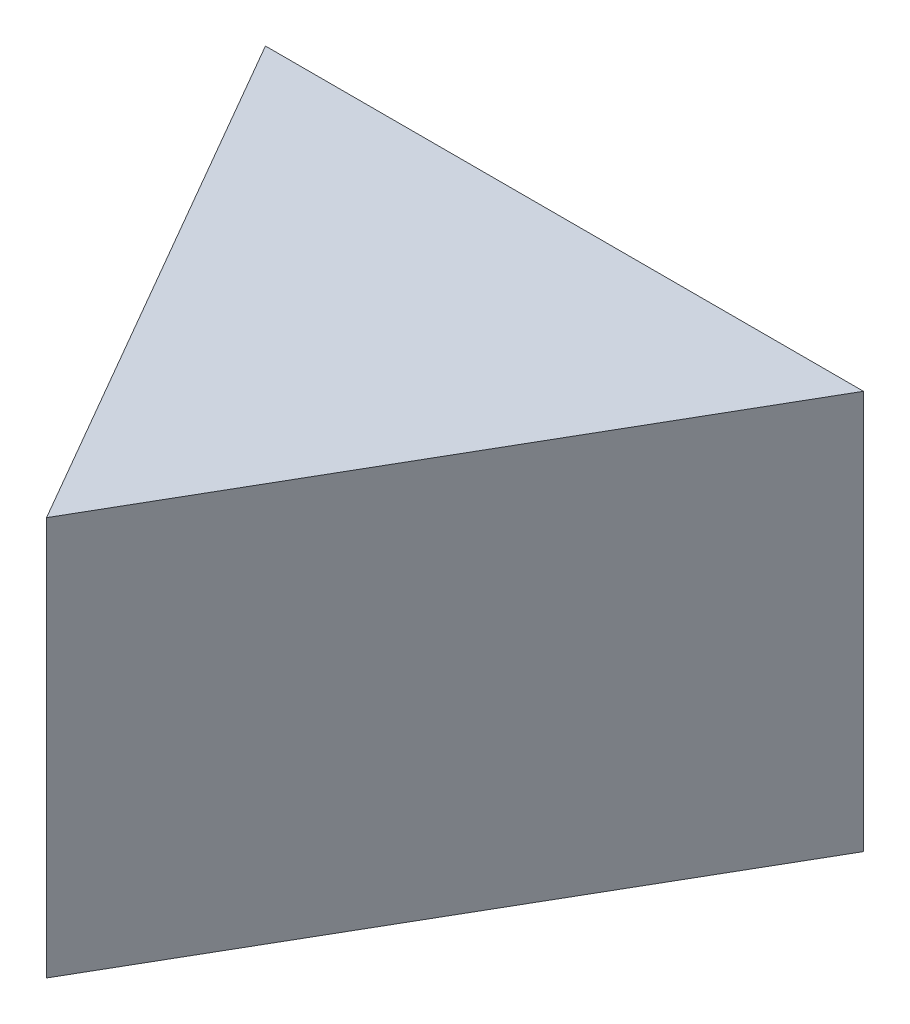
ISO-10303-21;
HEADER;
FILE_DESCRIPTION(('STEP AP214'),'2;1');
FILE_NAME('part.step','',(''),(''),'','','');
FILE_SCHEMA(('AUTOMOTIVE_DESIGN { 1 0 10303 214 1 1 1 1 }'));
ENDSEC;
DATA;
#1=APPLICATION_CONTEXT('core data for automotive mechanical design processes');
#2=APPLICATION_PROTOCOL_DEFINITION('international standard','automotive_design',2000,#1);
#3=PRODUCT_CONTEXT('',#1,'mechanical');
#4=PRODUCT('Part','Part','',(#3));
#5=PRODUCT_RELATED_PRODUCT_CATEGORY('part','',(#4));
#6=PRODUCT_DEFINITION_FORMATION('','',#4);
#7=PRODUCT_DEFINITION_CONTEXT('part definition',#1,'design');
#8=PRODUCT_DEFINITION('design','',#6,#7);
#9=PRODUCT_DEFINITION_SHAPE('','',#8);
#10=(LENGTH_UNIT() NAMED_UNIT(*) SI_UNIT(.MILLI.,.METRE.));
#11=(NAMED_UNIT(*) PLANE_ANGLE_UNIT() SI_UNIT($,.RADIAN.));
#12=(NAMED_UNIT(*) SI_UNIT($,.STERADIAN.) SOLID_ANGLE_UNIT());
#13=UNCERTAINTY_MEASURE_WITH_UNIT(LENGTH_MEASURE(1.E-05),#10,'distance_accuracy_value','');
#14=(GEOMETRIC_REPRESENTATION_CONTEXT(3) GLOBAL_UNCERTAINTY_ASSIGNED_CONTEXT((#13)) GLOBAL_UNIT_ASSIGNED_CONTEXT((#10,
#11,#12)) REPRESENTATION_CONTEXT('',''));
#15=CARTESIAN_POINT('',(0.,0.,0.));
#16=DIRECTION('',(0.,0.,1.));
#17=DIRECTION('',(1.,0.,0.));
#18=AXIS2_PLACEMENT_3D('',#15,#16,#17);
#19=CARTESIAN_POINT('',(-38.1000000000002,-25.4,-21.9970452561243));
#20=DIRECTION('',(-0.866025403784433,0.,0.50000000000001));
#21=DIRECTION('',(0.50000000000001,0.,0.866025403784433));
#22=AXIS2_PLACEMENT_3D('',#19,#20,#21);
#23=PLANE('',#22);
#24=DIRECTION('',(0.,1.,0.));
#25=VECTOR('',#24,1.);
#26=CARTESIAN_POINT('',(5.12854148458496E-13,-25.4,43.9940905122494));
#27=LINE('',#26,#25);
#28=CARTESIAN_POINT('',(5.12854148458496E-13,-25.4,43.9940905122494));
#29=VERTEX_POINT('',#28);
#30=CARTESIAN_POINT('',(5.12854148458496E-13,25.4,43.9940905122494));
#31=VERTEX_POINT('',#30);
#32=EDGE_CURVE('E36',#29,#31,#27,.T.);
#33=ORIENTED_EDGE('',*,*,#32,.T.);
#34=DIRECTION('',(0.50000000000001,0.,0.866025403784433));
#35=VECTOR('',#34,1.);
#36=CARTESIAN_POINT('',(-38.1000000000002,25.4,-21.9970452561243));
#37=LINE('',#36,#35);
#38=CARTESIAN_POINT('',(-38.1000000000002,25.4,-21.9970452561243));
#39=VERTEX_POINT('',#38);
#40=EDGE_CURVE('E67',#39,#31,#37,.T.);
#41=ORIENTED_EDGE('',*,*,#40,.F.);
#42=DIRECTION('',(0.,1.,0.));
#43=VECTOR('',#42,1.);
#44=CARTESIAN_POINT('',(-38.1000000000002,-25.4,-21.9970452561243));
#45=LINE('',#44,#43);
#46=CARTESIAN_POINT('',(-38.1000000000002,-25.4,-21.9970452561243));
#47=VERTEX_POINT('',#46);
#48=EDGE_CURVE('E11',#47,#39,#45,.T.);
#49=ORIENTED_EDGE('',*,*,#48,.F.);
#50=DIRECTION('',(0.50000000000001,0.,0.866025403784433));
#51=VECTOR('',#50,1.);
#52=CARTESIAN_POINT('',(-38.1000000000002,-25.4,-21.9970452561243));
#53=LINE('',#52,#51);
#54=EDGE_CURVE('E68',#47,#29,#53,.T.);
#55=ORIENTED_EDGE('',*,*,#54,.T.);
#56=EDGE_LOOP('',(#33,#41,#49,#55));
#57=FACE_BOUND('',#56,.T.);
#58=ADVANCED_FACE('F33',(#57),#23,.T.);
#59=CARTESIAN_POINT('',(38.0999999999998,-25.4,-21.9970452561253));
#60=DIRECTION('',(0.,0.,-1.));
#61=DIRECTION('',(-1.,0.,0.));
#62=AXIS2_PLACEMENT_3D('',#59,#60,#61);
#63=PLANE('',#62);
#64=ORIENTED_EDGE('',*,*,#48,.T.);
#65=DIRECTION('',(-1.,0.,0.));
#66=VECTOR('',#65,1.);
#67=CARTESIAN_POINT('',(38.0999999999998,25.4,-21.9970452561253));
#68=LINE('',#67,#66);
#69=CARTESIAN_POINT('',(38.0999999999998,25.4,-21.9970452561253));
#70=VERTEX_POINT('',#69);
#71=EDGE_CURVE('E77',#70,#39,#68,.T.);
#72=ORIENTED_EDGE('',*,*,#71,.F.);
#73=DIRECTION('',(0.,1.,0.));
#74=VECTOR('',#73,1.);
#75=CARTESIAN_POINT('',(38.0999999999998,-25.4,-21.9970452561253));
#76=LINE('',#75,#74);
#77=CARTESIAN_POINT('',(38.0999999999998,-25.4,-21.9970452561253));
#78=VERTEX_POINT('',#77);
#79=EDGE_CURVE('E41',#78,#70,#76,.T.);
#80=ORIENTED_EDGE('',*,*,#79,.F.);
#81=DIRECTION('',(-1.,0.,0.));
#82=VECTOR('',#81,1.);
#83=CARTESIAN_POINT('',(38.0999999999998,-25.4,-21.9970452561253));
#84=LINE('',#83,#82);
#85=EDGE_CURVE('E71',#78,#47,#84,.T.);
#86=ORIENTED_EDGE('',*,*,#85,.T.);
#87=EDGE_LOOP('',(#64,#72,#80,#86));
#88=FACE_BOUND('',#87,.T.);
#89=ADVANCED_FACE('F87',(#88),#63,.T.);
#90=CARTESIAN_POINT('',(5.12854148458496E-13,-25.4,43.9940905122494));
#91=DIRECTION('',(0.866025403784444,0.,0.49999999999999));
#92=DIRECTION('',(0.49999999999999,0.,-0.866025403784445));
#93=AXIS2_PLACEMENT_3D('',#90,#91,#92);
#94=PLANE('',#93);
#95=ORIENTED_EDGE('',*,*,#79,.T.);
#96=DIRECTION('',(0.49999999999999,0.,-0.866025403784444));
#97=VECTOR('',#96,1.);
#98=CARTESIAN_POINT('',(5.12854148458496E-13,25.4,43.9940905122494));
#99=LINE('',#98,#97);
#100=EDGE_CURVE('E73',#31,#70,#99,.T.);
#101=ORIENTED_EDGE('',*,*,#100,.F.);
#102=ORIENTED_EDGE('',*,*,#32,.F.);
#103=DIRECTION('',(0.49999999999999,0.,-0.866025403784444));
#104=VECTOR('',#103,1.);
#105=CARTESIAN_POINT('',(5.12854148458496E-13,-25.4,43.9940905122494));
#106=LINE('',#105,#104);
#107=EDGE_CURVE('E84',#29,#78,#106,.T.);
#108=ORIENTED_EDGE('',*,*,#107,.T.);
#109=EDGE_LOOP('',(#95,#101,#102,#108));
#110=FACE_BOUND('',#109,.T.);
#111=ADVANCED_FACE('F74',(#110),#94,.T.);
#112=CARTESIAN_POINT('',(0.,-25.4,0.));
#113=DIRECTION('',(0.,1.,0.));
#114=DIRECTION('',(0.,0.,1.));
#115=AXIS2_PLACEMENT_3D('',#112,#113,#114);
#116=PLANE('',#115);
#117=ORIENTED_EDGE('',*,*,#54,.F.);
#118=ORIENTED_EDGE('',*,*,#85,.F.);
#119=ORIENTED_EDGE('',*,*,#107,.F.);
#120=EDGE_LOOP('',(#117,#118,#119));
#121=FACE_BOUND('',#120,.T.);
#122=ADVANCED_FACE('F89',(#121),#116,.F.);
#123=CARTESIAN_POINT('',(0.,25.4,0.));
#124=DIRECTION('',(0.,1.,0.));
#125=DIRECTION('',(0.,0.,1.));
#126=AXIS2_PLACEMENT_3D('',#123,#124,#125);
#127=PLANE('',#126);
#128=ORIENTED_EDGE('',*,*,#40,.T.);
#129=ORIENTED_EDGE('',*,*,#100,.T.);
#130=ORIENTED_EDGE('',*,*,#71,.T.);
#131=EDGE_LOOP('',(#128,#129,#130));
#132=FACE_BOUND('',#131,.T.);
#133=ADVANCED_FACE('F79',(#132),#127,.T.);
#134=CLOSED_SHELL('',(#58,#89,#111,#122,#133));
#135=MANIFOLD_SOLID_BREP('B2',#134);
#136=ADVANCED_BREP_SHAPE_REPRESENTATION('',(#18,#135),#14);
#137=SHAPE_DEFINITION_REPRESENTATION(#9,#136);
ENDSEC;
END-ISO-10303-21;
